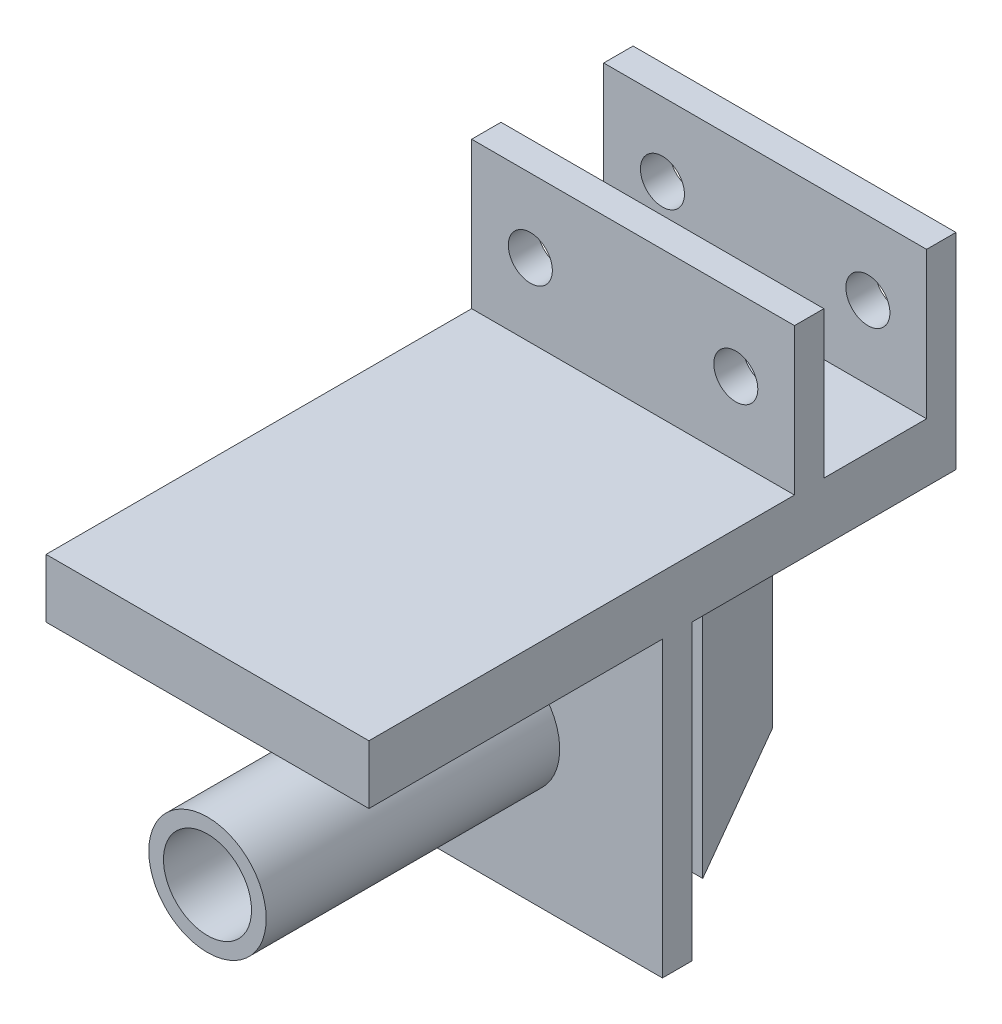
ISO-10303-21;
HEADER;
FILE_DESCRIPTION(('STEP AP214'),'2;1');
FILE_NAME('part.step','',(''),(''),'','','');
FILE_SCHEMA(('AUTOMOTIVE_DESIGN { 1 0 10303 214 1 1 1 1 }'));
ENDSEC;
DATA;
#1=APPLICATION_CONTEXT('core data for automotive mechanical design processes');
#2=APPLICATION_PROTOCOL_DEFINITION('international standard','automotive_design',2000,#1);
#3=PRODUCT_CONTEXT('',#1,'mechanical');
#4=PRODUCT('Part','Part','',(#3));
#5=PRODUCT_RELATED_PRODUCT_CATEGORY('part','',(#4));
#6=PRODUCT_DEFINITION_FORMATION('','',#4);
#7=PRODUCT_DEFINITION_CONTEXT('part definition',#1,'design');
#8=PRODUCT_DEFINITION('design','',#6,#7);
#9=PRODUCT_DEFINITION_SHAPE('','',#8);
#10=(LENGTH_UNIT() NAMED_UNIT(*) SI_UNIT(.MILLI.,.METRE.));
#11=(NAMED_UNIT(*) PLANE_ANGLE_UNIT() SI_UNIT($,.RADIAN.));
#12=(NAMED_UNIT(*) SI_UNIT($,.STERADIAN.) SOLID_ANGLE_UNIT());
#13=UNCERTAINTY_MEASURE_WITH_UNIT(LENGTH_MEASURE(1.E-05),#10,'distance_accuracy_value','');
#14=(GEOMETRIC_REPRESENTATION_CONTEXT(3) GLOBAL_UNCERTAINTY_ASSIGNED_CONTEXT((#13)) GLOBAL_UNIT_ASSIGNED_CONTEXT((#10,
#11,#12)) REPRESENTATION_CONTEXT('',''));
#15=CARTESIAN_POINT('',(0.,0.,0.));
#16=DIRECTION('',(0.,0.,1.));
#17=DIRECTION('',(1.,0.,0.));
#18=AXIS2_PLACEMENT_3D('',#15,#16,#17);
#19=CARTESIAN_POINT('',(0.,0.,0.));
#20=DIRECTION('',(0.,1.,0.));
#21=DIRECTION('',(0.,0.,1.));
#22=AXIS2_PLACEMENT_3D('',#19,#20,#21);
#23=PLANE('',#22);
#24=DIRECTION('',(1.,0.,0.));
#25=VECTOR('',#24,1.);
#26=CARTESIAN_POINT('',(-45.831985696917,0.,8.44161698032525));
#27=LINE('',#26,#25);
#28=CARTESIAN_POINT('',(-45.831985696917,0.,8.44161698032525));
#29=VERTEX_POINT('',#28);
#30=CARTESIAN_POINT('',(-23.831985696917,0.,8.44161698032525));
#31=VERTEX_POINT('',#30);
#32=EDGE_CURVE('E187',#29,#31,#27,.T.);
#33=ORIENTED_EDGE('',*,*,#32,.F.);
#34=DIRECTION('',(0.,0.,1.));
#35=VECTOR('',#34,1.);
#36=CARTESIAN_POINT('',(-45.831985696917,0.,-9.55838301967474));
#37=LINE('',#36,#35);
#38=CARTESIAN_POINT('',(-45.831985696917,0.,-9.55838301967474));
#39=VERTEX_POINT('',#38);
#40=EDGE_CURVE('E291',#39,#29,#37,.T.);
#41=ORIENTED_EDGE('',*,*,#40,.F.);
#42=DIRECTION('',(-1.,0.,0.));
#43=VECTOR('',#42,1.);
#44=CARTESIAN_POINT('',(-45.831985696917,0.,-9.55838301967474));
#45=LINE('',#44,#43);
#46=CARTESIAN_POINT('',(-23.831985696917,0.,-9.55838301967474));
#47=VERTEX_POINT('',#46);
#48=EDGE_CURVE('E300',#47,#39,#45,.T.);
#49=ORIENTED_EDGE('',*,*,#48,.F.);
#50=DIRECTION('',(0.,0.,-1.));
#51=VECTOR('',#50,1.);
#52=CARTESIAN_POINT('',(-23.831985696917,0.,-9.55838301967474));
#53=LINE('',#52,#51);
#54=EDGE_CURVE('E296',#31,#47,#53,.T.);
#55=ORIENTED_EDGE('',*,*,#54,.F.);
#56=EDGE_LOOP('',(#33,#41,#49,#55));
#57=FACE_BOUND('',#56,.T.);
#58=DIRECTION('',(0.5,0.,-0.866025403784439));
#59=VECTOR('',#58,1.);
#60=CARTESIAN_POINT('',(-41.331985696917,0.,3.19439373005782));
#61=LINE('',#60,#59);
#62=CARTESIAN_POINT('',(-41.331985696917,0.,3.19439373005782));
#63=VERTEX_POINT('',#62);
#64=CARTESIAN_POINT('',(-34.831985696917,0.,-8.06393651913988));
#65=VERTEX_POINT('',#64);
#66=EDGE_CURVE('E172',#63,#65,#61,.T.);
#67=ORIENTED_EDGE('',*,*,#66,.F.);
#68=DIRECTION('',(-1.,0.,0.));
#69=VECTOR('',#68,1.);
#70=CARTESIAN_POINT('',(-28.331985696917,0.,3.19439373005782));
#71=LINE('',#70,#69);
#72=CARTESIAN_POINT('',(-28.331985696917,0.,3.19439373005782));
#73=VERTEX_POINT('',#72);
#74=EDGE_CURVE('E55',#73,#63,#71,.T.);
#75=ORIENTED_EDGE('',*,*,#74,.F.);
#76=DIRECTION('',(0.5,0.,0.866025403784439));
#77=VECTOR('',#76,1.);
#78=CARTESIAN_POINT('',(-34.831985696917,0.,-8.06393651913988));
#79=LINE('',#78,#77);
#80=EDGE_CURVE('E51',#65,#73,#79,.T.);
#81=ORIENTED_EDGE('',*,*,#80,.F.);
#82=EDGE_LOOP('',(#67,#75,#81));
#83=FACE_BOUND('',#82,.T.);
#84=ADVANCED_FACE('F36',(#57,#83),#23,.F.);
#85=DIRECTION('',(-1.,0.,0.));
#86=VECTOR('',#85,1.);
#87=CARTESIAN_POINT('',(-45.831985696917,0.,10.4416169803253));
#88=LINE('',#87,#86);
#89=CARTESIAN_POINT('',(-23.831985696917,0.,10.4416169803253));
#90=VERTEX_POINT('',#89);
#91=CARTESIAN_POINT('',(-45.831985696917,0.,10.4416169803253));
#92=VERTEX_POINT('',#91);
#93=EDGE_CURVE('E192',#90,#92,#88,.T.);
#94=ORIENTED_EDGE('',*,*,#93,.F.);
#95=CARTESIAN_POINT('',(-23.831985696917,0.,30.4416169803253));
#96=VERTEX_POINT('',#95);
#97=EDGE_CURVE('E297',#96,#90,#53,.T.);
#98=ORIENTED_EDGE('',*,*,#97,.F.);
#99=DIRECTION('',(1.,0.,0.));
#100=VECTOR('',#99,1.);
#101=CARTESIAN_POINT('',(-45.831985696917,0.,30.4416169803253));
#102=LINE('',#101,#100);
#103=CARTESIAN_POINT('',(-45.831985696917,0.,30.4416169803253));
#104=VERTEX_POINT('',#103);
#105=EDGE_CURVE('E294',#104,#96,#102,.T.);
#106=ORIENTED_EDGE('',*,*,#105,.F.);
#107=EDGE_CURVE('E281',#92,#104,#37,.T.);
#108=ORIENTED_EDGE('',*,*,#107,.F.);
#109=EDGE_LOOP('',(#94,#98,#106,#108));
#110=FACE_BOUND('',#109,.T.);
#111=ADVANCED_FACE('F362',(#110),#23,.F.);
#112=CARTESIAN_POINT('',(0.,4.,0.));
#113=DIRECTION('',(0.,1.,0.));
#114=DIRECTION('',(0.,0.,1.));
#115=AXIS2_PLACEMENT_3D('',#112,#113,#114);
#116=PLANE('',#115);
#117=DIRECTION('',(0.,0.,-1.));
#118=VECTOR('',#117,1.);
#119=CARTESIAN_POINT('',(-23.831985696917,4.,-9.55838301967474));
#120=LINE('',#119,#118);
#121=CARTESIAN_POINT('',(-23.831985696917,4.,30.4416169803253));
#122=VERTEX_POINT('',#121);
#123=CARTESIAN_POINT('',(-23.831985696917,4.,1.44161698032526));
#124=VERTEX_POINT('',#123);
#125=EDGE_CURVE('E288',#122,#124,#120,.T.);
#126=ORIENTED_EDGE('',*,*,#125,.T.);
#127=DIRECTION('',(1.,0.,0.));
#128=VECTOR('',#127,1.);
#129=CARTESIAN_POINT('',(0.,4.,1.44161698032526));
#130=LINE('',#129,#128);
#131=CARTESIAN_POINT('',(-45.831985696917,4.,1.44161698032526));
#132=VERTEX_POINT('',#131);
#133=EDGE_CURVE('E234',#132,#124,#130,.T.);
#134=ORIENTED_EDGE('',*,*,#133,.F.);
#135=DIRECTION('',(0.,0.,1.));
#136=VECTOR('',#135,1.);
#137=CARTESIAN_POINT('',(-45.831985696917,4.,-9.55838301967474));
#138=LINE('',#137,#136);
#139=CARTESIAN_POINT('',(-45.831985696917,4.,30.4416169803253));
#140=VERTEX_POINT('',#139);
#141=EDGE_CURVE('E285',#132,#140,#138,.T.);
#142=ORIENTED_EDGE('',*,*,#141,.T.);
#143=DIRECTION('',(1.,0.,0.));
#144=VECTOR('',#143,1.);
#145=CARTESIAN_POINT('',(-45.831985696917,4.,30.4416169803253));
#146=LINE('',#145,#144);
#147=EDGE_CURVE('E284',#140,#122,#146,.T.);
#148=ORIENTED_EDGE('',*,*,#147,.T.);
#149=EDGE_LOOP('',(#126,#134,#142,#148));
#150=FACE_BOUND('',#149,.T.);
#151=ADVANCED_FACE('F352',(#150),#116,.T.);
#152=CARTESIAN_POINT('',(-45.831985696917,4.,-9.55838301967474));
#153=DIRECTION('',(1.,0.,0.));
#154=DIRECTION('',(0.,0.,-1.));
#155=AXIS2_PLACEMENT_3D('',#152,#153,#154);
#156=PLANE('',#155);
#157=ORIENTED_EDGE('',*,*,#40,.T.);
#158=DIRECTION('',(0.,1.,0.));
#159=VECTOR('',#158,1.);
#160=CARTESIAN_POINT('',(-45.831985696917,-20.,8.44161698032525));
#161=LINE('',#160,#159);
#162=CARTESIAN_POINT('',(-45.831985696917,-20.,8.44161698032525));
#163=VERTEX_POINT('',#162);
#164=EDGE_CURVE('E211',#163,#29,#161,.T.);
#165=ORIENTED_EDGE('',*,*,#164,.F.);
#166=DIRECTION('',(0.,0.,-1.));
#167=VECTOR('',#166,1.);
#168=CARTESIAN_POINT('',(-45.831985696917,-20.,10.4416169803253));
#169=LINE('',#168,#167);
#170=CARTESIAN_POINT('',(-45.831985696917,-20.,10.4416169803253));
#171=VERTEX_POINT('',#170);
#172=EDGE_CURVE('E188',#171,#163,#169,.T.);
#173=ORIENTED_EDGE('',*,*,#172,.F.);
#174=DIRECTION('',(0.,1.,0.));
#175=VECTOR('',#174,1.);
#176=CARTESIAN_POINT('',(-45.831985696917,-20.,10.4416169803253));
#177=LINE('',#176,#175);
#178=EDGE_CURVE('E198',#171,#92,#177,.T.);
#179=ORIENTED_EDGE('',*,*,#178,.T.);
#180=ORIENTED_EDGE('',*,*,#107,.T.);
#181=DIRECTION('',(0.,-1.,0.));
#182=VECTOR('',#181,1.);
#183=CARTESIAN_POINT('',(-45.831985696917,4.,30.4416169803253));
#184=LINE('',#183,#182);
#185=EDGE_CURVE('E44',#140,#104,#184,.T.);
#186=ORIENTED_EDGE('',*,*,#185,.F.);
#187=ORIENTED_EDGE('',*,*,#141,.F.);
#188=DIRECTION('',(0.,-1.,0.));
#189=VECTOR('',#188,1.);
#190=CARTESIAN_POINT('',(-45.831985696917,14.,1.44161698032526));
#191=LINE('',#190,#189);
#192=CARTESIAN_POINT('',(-45.831985696917,14.,1.44161698032526));
#193=VERTEX_POINT('',#192);
#194=EDGE_CURVE('E258',#193,#132,#191,.T.);
#195=ORIENTED_EDGE('',*,*,#194,.F.);
#196=DIRECTION('',(0.,0.,1.));
#197=VECTOR('',#196,1.);
#198=CARTESIAN_POINT('',(-45.831985696917,14.,0.));
#199=LINE('',#198,#197);
#200=CARTESIAN_POINT('',(-45.831985696917,14.,-0.558383019674744));
#201=VERTEX_POINT('',#200);
#202=EDGE_CURVE('E235',#201,#193,#199,.T.);
#203=ORIENTED_EDGE('',*,*,#202,.F.);
#204=DIRECTION('',(0.,-1.,0.));
#205=VECTOR('',#204,1.);
#206=CARTESIAN_POINT('',(-45.831985696917,14.,-0.558383019674744));
#207=LINE('',#206,#205);
#208=CARTESIAN_POINT('',(-45.831985696917,4.,-0.558383019674744));
#209=VERTEX_POINT('',#208);
#210=EDGE_CURVE('E246',#201,#209,#207,.T.);
#211=ORIENTED_EDGE('',*,*,#210,.T.);
#212=CARTESIAN_POINT('',(-45.831985696917,4.,-7.55838301967474));
#213=VERTEX_POINT('',#212);
#214=EDGE_CURVE('E282',#213,#209,#138,.T.);
#215=ORIENTED_EDGE('',*,*,#214,.F.);
#216=DIRECTION('',(0.,-1.,0.));
#217=VECTOR('',#216,1.);
#218=CARTESIAN_POINT('',(-45.831985696917,14.,-7.55838301967474));
#219=LINE('',#218,#217);
#220=CARTESIAN_POINT('',(-45.831985696917,14.,-7.55838301967474));
#221=VERTEX_POINT('',#220);
#222=EDGE_CURVE('E278',#221,#213,#219,.T.);
#223=ORIENTED_EDGE('',*,*,#222,.F.);
#224=DIRECTION('',(0.,0.,1.));
#225=VECTOR('',#224,1.);
#226=CARTESIAN_POINT('',(-45.831985696917,14.,0.));
#227=LINE('',#226,#225);
#228=CARTESIAN_POINT('',(-45.831985696917,14.,-9.55838301967474));
#229=VERTEX_POINT('',#228);
#230=EDGE_CURVE('E262',#229,#221,#227,.T.);
#231=ORIENTED_EDGE('',*,*,#230,.F.);
#232=DIRECTION('',(0.,-1.,0.));
#233=VECTOR('',#232,1.);
#234=CARTESIAN_POINT('',(-45.831985696917,4.,-9.55838301967474));
#235=LINE('',#234,#233);
#236=EDGE_CURVE('E290',#229,#39,#235,.T.);
#237=ORIENTED_EDGE('',*,*,#236,.T.);
#238=EDGE_LOOP('',(#157,#165,#173,#179,#180,#186,#187,#195,#203,#211,#215,#223,#231,#237));
#239=FACE_BOUND('',#238,.T.);
#240=ADVANCED_FACE('F38',(#239),#156,.F.);
#241=CARTESIAN_POINT('',(-45.831985696917,4.,30.4416169803253));
#242=DIRECTION('',(0.,0.,-1.));
#243=DIRECTION('',(-1.,0.,0.));
#244=AXIS2_PLACEMENT_3D('',#241,#242,#243);
#245=PLANE('',#244);
#246=ORIENTED_EDGE('',*,*,#105,.T.);
#247=DIRECTION('',(0.,-1.,0.));
#248=VECTOR('',#247,1.);
#249=CARTESIAN_POINT('',(-23.831985696917,4.,30.4416169803253));
#250=LINE('',#249,#248);
#251=EDGE_CURVE('E307',#122,#96,#250,.T.);
#252=ORIENTED_EDGE('',*,*,#251,.F.);
#253=ORIENTED_EDGE('',*,*,#147,.F.);
#254=ORIENTED_EDGE('',*,*,#185,.T.);
#255=EDGE_LOOP('',(#246,#252,#253,#254));
#256=FACE_BOUND('',#255,.T.);
#257=ADVANCED_FACE('F357',(#256),#245,.F.);
#258=CARTESIAN_POINT('',(-23.831985696917,4.,-9.55838301967474));
#259=DIRECTION('',(-1.,0.,0.));
#260=DIRECTION('',(0.,0.,1.));
#261=AXIS2_PLACEMENT_3D('',#258,#259,#260);
#262=PLANE('',#261);
#263=ORIENTED_EDGE('',*,*,#97,.T.);
#264=DIRECTION('',(0.,1.,0.));
#265=VECTOR('',#264,1.);
#266=CARTESIAN_POINT('',(-23.831985696917,-20.,10.4416169803253));
#267=LINE('',#266,#265);
#268=CARTESIAN_POINT('',(-23.831985696917,-20.,10.4416169803253));
#269=VERTEX_POINT('',#268);
#270=EDGE_CURVE('E205',#269,#90,#267,.T.);
#271=ORIENTED_EDGE('',*,*,#270,.F.);
#272=DIRECTION('',(0.,0.,1.));
#273=VECTOR('',#272,1.);
#274=CARTESIAN_POINT('',(-23.831985696917,-20.,10.4416169803253));
#275=LINE('',#274,#273);
#276=CARTESIAN_POINT('',(-23.831985696917,-20.,8.44161698032525));
#277=VERTEX_POINT('',#276);
#278=EDGE_CURVE('E194',#277,#269,#275,.T.);
#279=ORIENTED_EDGE('',*,*,#278,.F.);
#280=DIRECTION('',(0.,1.,0.));
#281=VECTOR('',#280,1.);
#282=CARTESIAN_POINT('',(-23.831985696917,-20.,8.44161698032525));
#283=LINE('',#282,#281);
#284=EDGE_CURVE('E208',#277,#31,#283,.T.);
#285=ORIENTED_EDGE('',*,*,#284,.T.);
#286=ORIENTED_EDGE('',*,*,#54,.T.);
#287=DIRECTION('',(0.,-1.,0.));
#288=VECTOR('',#287,1.);
#289=CARTESIAN_POINT('',(-23.831985696917,4.,-9.55838301967474));
#290=LINE('',#289,#288);
#291=CARTESIAN_POINT('',(-23.831985696917,14.,-9.55838301967474));
#292=VERTEX_POINT('',#291);
#293=EDGE_CURVE('E304',#292,#47,#290,.T.);
#294=ORIENTED_EDGE('',*,*,#293,.F.);
#295=DIRECTION('',(0.,0.,-1.));
#296=VECTOR('',#295,1.);
#297=CARTESIAN_POINT('',(-23.831985696917,14.,0.));
#298=LINE('',#297,#296);
#299=CARTESIAN_POINT('',(-23.831985696917,14.,-7.55838301967474));
#300=VERTEX_POINT('',#299);
#301=EDGE_CURVE('E267',#300,#292,#298,.T.);
#302=ORIENTED_EDGE('',*,*,#301,.F.);
#303=DIRECTION('',(0.,-1.,0.));
#304=VECTOR('',#303,1.);
#305=CARTESIAN_POINT('',(-23.831985696917,14.,-7.55838301967474));
#306=LINE('',#305,#304);
#307=CARTESIAN_POINT('',(-23.831985696917,4.,-7.55838301967474));
#308=VERTEX_POINT('',#307);
#309=EDGE_CURVE('E273',#300,#308,#306,.T.);
#310=ORIENTED_EDGE('',*,*,#309,.T.);
#311=CARTESIAN_POINT('',(-23.831985696917,4.,-0.558383019674744));
#312=VERTEX_POINT('',#311);
#313=EDGE_CURVE('E287',#312,#308,#120,.T.);
#314=ORIENTED_EDGE('',*,*,#313,.F.);
#315=DIRECTION('',(0.,-1.,0.));
#316=VECTOR('',#315,1.);
#317=CARTESIAN_POINT('',(-23.831985696917,14.,-0.558383019674744));
#318=LINE('',#317,#316);
#319=CARTESIAN_POINT('',(-23.831985696917,14.,-0.558383019674744));
#320=VERTEX_POINT('',#319);
#321=EDGE_CURVE('E252',#320,#312,#318,.T.);
#322=ORIENTED_EDGE('',*,*,#321,.F.);
#323=DIRECTION('',(0.,0.,-1.));
#324=VECTOR('',#323,1.);
#325=CARTESIAN_POINT('',(-23.831985696917,14.,0.));
#326=LINE('',#325,#324);
#327=CARTESIAN_POINT('',(-23.831985696917,14.,1.44161698032526));
#328=VERTEX_POINT('',#327);
#329=EDGE_CURVE('E241',#328,#320,#326,.T.);
#330=ORIENTED_EDGE('',*,*,#329,.F.);
#331=DIRECTION('',(0.,-1.,0.));
#332=VECTOR('',#331,1.);
#333=CARTESIAN_POINT('',(-23.831985696917,14.,1.44161698032526));
#334=LINE('',#333,#332);
#335=EDGE_CURVE('E255',#328,#124,#334,.T.);
#336=ORIENTED_EDGE('',*,*,#335,.T.);
#337=ORIENTED_EDGE('',*,*,#125,.F.);
#338=ORIENTED_EDGE('',*,*,#251,.T.);
#339=EDGE_LOOP('',(#263,#271,#279,#285,#286,#294,#302,#310,#314,#322,#330,#336,#337,#338));
#340=FACE_BOUND('',#339,.T.);
#341=ADVANCED_FACE('F335',(#340),#262,.F.);
#342=CARTESIAN_POINT('',(-45.831985696917,4.,-9.55838301967474));
#343=DIRECTION('',(0.,0.,1.));
#344=DIRECTION('',(1.,0.,0.));
#345=AXIS2_PLACEMENT_3D('',#342,#343,#344);
#346=PLANE('',#345);
#347=CARTESIAN_POINT('',(-27.831985696917,9.,-9.55838301967474));
#348=DIRECTION('',(0.,0.,1.));
#349=DIRECTION('',(1.,0.,0.));
#350=AXIS2_PLACEMENT_3D('',#347,#348,#349);
#351=CIRCLE('',#350,1.5);
#352=CARTESIAN_POINT('',(-26.331985696917,9.,-9.55838301967474));
#353=VERTEX_POINT('',#352);
#354=EDGE_CURVE('E215',#353,#353,#351,.T.);
#355=ORIENTED_EDGE('',*,*,#354,.T.);
#356=EDGE_LOOP('',(#355));
#357=FACE_BOUND('',#356,.T.);
#358=CARTESIAN_POINT('',(-41.831985696917,9.,-9.55838301967474));
#359=DIRECTION('',(0.,0.,1.));
#360=DIRECTION('',(1.,0.,0.));
#361=AXIS2_PLACEMENT_3D('',#358,#359,#360);
#362=CIRCLE('',#361,1.5);
#363=CARTESIAN_POINT('',(-40.331985696917,9.,-9.55838301967474));
#364=VERTEX_POINT('',#363);
#365=EDGE_CURVE('E225',#364,#364,#362,.T.);
#366=ORIENTED_EDGE('',*,*,#365,.T.);
#367=EDGE_LOOP('',(#366));
#368=FACE_BOUND('',#367,.T.);
#369=ORIENTED_EDGE('',*,*,#48,.T.);
#370=ORIENTED_EDGE('',*,*,#236,.F.);
#371=DIRECTION('',(-1.,0.,0.));
#372=VECTOR('',#371,1.);
#373=CARTESIAN_POINT('',(0.,14.,-9.55838301967474));
#374=LINE('',#373,#372);
#375=EDGE_CURVE('E270',#292,#229,#374,.T.);
#376=ORIENTED_EDGE('',*,*,#375,.F.);
#377=ORIENTED_EDGE('',*,*,#293,.T.);
#378=EDGE_LOOP('',(#369,#370,#376,#377));
#379=FACE_BOUND('',#378,.T.);
#380=ADVANCED_FACE('F380',(#357,#368,#379),#346,.F.);
#381=DIRECTION('',(1.,0.,0.));
#382=VECTOR('',#381,1.);
#383=CARTESIAN_POINT('',(0.,4.,-0.558383019674744));
#384=LINE('',#383,#382);
#385=EDGE_CURVE('E239',#209,#312,#384,.T.);
#386=ORIENTED_EDGE('',*,*,#385,.T.);
#387=ORIENTED_EDGE('',*,*,#313,.T.);
#388=DIRECTION('',(1.,0.,0.));
#389=VECTOR('',#388,1.);
#390=CARTESIAN_POINT('',(0.,4.,-7.55838301967474));
#391=LINE('',#390,#389);
#392=EDGE_CURVE('E261',#213,#308,#391,.T.);
#393=ORIENTED_EDGE('',*,*,#392,.F.);
#394=ORIENTED_EDGE('',*,*,#214,.T.);
#395=EDGE_LOOP('',(#386,#387,#393,#394));
#396=FACE_BOUND('',#395,.T.);
#397=ADVANCED_FACE('F332',(#396),#116,.T.);
#398=CARTESIAN_POINT('',(0.,14.,-7.55838301967474));
#399=DIRECTION('',(0.,0.,-1.));
#400=DIRECTION('',(-1.,0.,0.));
#401=AXIS2_PLACEMENT_3D('',#398,#399,#400);
#402=PLANE('',#401);
#403=CARTESIAN_POINT('',(-27.831985696917,9.,-7.55838301967474));
#404=DIRECTION('',(0.,0.,-1.));
#405=DIRECTION('',(-1.,0.,0.));
#406=AXIS2_PLACEMENT_3D('',#403,#404,#405);
#407=CIRCLE('',#406,1.5);
#408=CARTESIAN_POINT('',(-29.331985696917,9.,-7.55838301967474));
#409=VERTEX_POINT('',#408);
#410=EDGE_CURVE('E221',#409,#409,#407,.T.);
#411=ORIENTED_EDGE('',*,*,#410,.T.);
#412=EDGE_LOOP('',(#411));
#413=FACE_BOUND('',#412,.T.);
#414=CARTESIAN_POINT('',(-41.831985696917,9.,-7.55838301967474));
#415=DIRECTION('',(0.,0.,-1.));
#416=DIRECTION('',(-1.,0.,0.));
#417=AXIS2_PLACEMENT_3D('',#414,#415,#416);
#418=CIRCLE('',#417,1.5);
#419=CARTESIAN_POINT('',(-43.331985696917,9.,-7.55838301967474));
#420=VERTEX_POINT('',#419);
#421=EDGE_CURVE('E231',#420,#420,#418,.T.);
#422=ORIENTED_EDGE('',*,*,#421,.T.);
#423=EDGE_LOOP('',(#422));
#424=FACE_BOUND('',#423,.T.);
#425=ORIENTED_EDGE('',*,*,#392,.T.);
#426=ORIENTED_EDGE('',*,*,#309,.F.);
#427=DIRECTION('',(1.,0.,0.));
#428=VECTOR('',#427,1.);
#429=CARTESIAN_POINT('',(0.,14.,-7.55838301967474));
#430=LINE('',#429,#428);
#431=EDGE_CURVE('E265',#221,#300,#430,.T.);
#432=ORIENTED_EDGE('',*,*,#431,.F.);
#433=ORIENTED_EDGE('',*,*,#222,.T.);
#434=EDGE_LOOP('',(#425,#426,#432,#433));
#435=FACE_BOUND('',#434,.T.);
#436=ADVANCED_FACE('F340',(#413,#424,#435),#402,.F.);
#437=CARTESIAN_POINT('',(0.,14.,0.));
#438=DIRECTION('',(0.,1.,0.));
#439=DIRECTION('',(0.,0.,1.));
#440=AXIS2_PLACEMENT_3D('',#437,#438,#439);
#441=PLANE('',#440);
#442=ORIENTED_EDGE('',*,*,#230,.T.);
#443=ORIENTED_EDGE('',*,*,#431,.T.);
#444=ORIENTED_EDGE('',*,*,#301,.T.);
#445=ORIENTED_EDGE('',*,*,#375,.T.);
#446=EDGE_LOOP('',(#442,#443,#444,#445));
#447=FACE_BOUND('',#446,.T.);
#448=ADVANCED_FACE('F382',(#447),#441,.T.);
#449=CARTESIAN_POINT('',(0.,14.,1.44161698032526));
#450=DIRECTION('',(0.,0.,-1.));
#451=DIRECTION('',(-1.,0.,0.));
#452=AXIS2_PLACEMENT_3D('',#449,#450,#451);
#453=PLANE('',#452);
#454=CARTESIAN_POINT('',(-27.831985696917,9.,1.44161698032526));
#455=DIRECTION('',(0.,0.,1.));
#456=DIRECTION('',(1.,0.,0.));
#457=AXIS2_PLACEMENT_3D('',#454,#455,#456);
#458=CIRCLE('',#457,1.5);
#459=CARTESIAN_POINT('',(-26.331985696917,9.,1.44161698032526));
#460=VERTEX_POINT('',#459);
#461=EDGE_CURVE('E214',#460,#460,#458,.T.);
#462=ORIENTED_EDGE('',*,*,#461,.F.);
#463=EDGE_LOOP('',(#462));
#464=FACE_BOUND('',#463,.T.);
#465=CARTESIAN_POINT('',(-41.831985696917,9.,1.44161698032526));
#466=DIRECTION('',(0.,0.,1.));
#467=DIRECTION('',(1.,0.,0.));
#468=AXIS2_PLACEMENT_3D('',#465,#466,#467);
#469=CIRCLE('',#468,1.5);
#470=CARTESIAN_POINT('',(-40.331985696917,9.,1.44161698032526));
#471=VERTEX_POINT('',#470);
#472=EDGE_CURVE('E224',#471,#471,#469,.T.);
#473=ORIENTED_EDGE('',*,*,#472,.F.);
#474=EDGE_LOOP('',(#473));
#475=FACE_BOUND('',#474,.T.);
#476=ORIENTED_EDGE('',*,*,#133,.T.);
#477=ORIENTED_EDGE('',*,*,#335,.F.);
#478=DIRECTION('',(1.,0.,0.));
#479=VECTOR('',#478,1.);
#480=CARTESIAN_POINT('',(0.,14.,1.44161698032526));
#481=LINE('',#480,#479);
#482=EDGE_CURVE('E238',#193,#328,#481,.T.);
#483=ORIENTED_EDGE('',*,*,#482,.F.);
#484=ORIENTED_EDGE('',*,*,#194,.T.);
#485=EDGE_LOOP('',(#476,#477,#483,#484));
#486=FACE_BOUND('',#485,.T.);
#487=ADVANCED_FACE('F323',(#464,#475,#486),#453,.F.);
#488=CARTESIAN_POINT('',(0.,14.,-0.558383019674744));
#489=DIRECTION('',(0.,0.,-1.));
#490=DIRECTION('',(-1.,0.,0.));
#491=AXIS2_PLACEMENT_3D('',#488,#489,#490);
#492=PLANE('',#491);
#493=CARTESIAN_POINT('',(-27.831985696917,9.,-0.558383019674744));
#494=DIRECTION('',(0.,0.,-1.));
#495=DIRECTION('',(-1.,0.,0.));
#496=AXIS2_PLACEMENT_3D('',#493,#494,#495);
#497=CIRCLE('',#496,1.5);
#498=CARTESIAN_POINT('',(-29.331985696917,9.,-0.558383019674744));
#499=VERTEX_POINT('',#498);
#500=EDGE_CURVE('E218',#499,#499,#497,.T.);
#501=ORIENTED_EDGE('',*,*,#500,.F.);
#502=EDGE_LOOP('',(#501));
#503=FACE_BOUND('',#502,.T.);
#504=CARTESIAN_POINT('',(-41.831985696917,9.,-0.558383019674744));
#505=DIRECTION('',(0.,0.,-1.));
#506=DIRECTION('',(-1.,0.,0.));
#507=AXIS2_PLACEMENT_3D('',#504,#505,#506);
#508=CIRCLE('',#507,1.5);
#509=CARTESIAN_POINT('',(-43.331985696917,9.,-0.558383019674744));
#510=VERTEX_POINT('',#509);
#511=EDGE_CURVE('E228',#510,#510,#508,.T.);
#512=ORIENTED_EDGE('',*,*,#511,.F.);
#513=EDGE_LOOP('',(#512));
#514=FACE_BOUND('',#513,.T.);
#515=ORIENTED_EDGE('',*,*,#385,.F.);
#516=ORIENTED_EDGE('',*,*,#210,.F.);
#517=DIRECTION('',(1.,0.,0.));
#518=VECTOR('',#517,1.);
#519=CARTESIAN_POINT('',(0.,14.,-0.558383019674744));
#520=LINE('',#519,#518);
#521=EDGE_CURVE('E243',#201,#320,#520,.T.);
#522=ORIENTED_EDGE('',*,*,#521,.T.);
#523=ORIENTED_EDGE('',*,*,#321,.T.);
#524=EDGE_LOOP('',(#515,#516,#522,#523));
#525=FACE_BOUND('',#524,.T.);
#526=ADVANCED_FACE('F319',(#503,#514,#525),#492,.T.);
#527=CARTESIAN_POINT('',(0.,14.,0.));
#528=DIRECTION('',(0.,1.,0.));
#529=DIRECTION('',(0.,0.,1.));
#530=AXIS2_PLACEMENT_3D('',#527,#528,#529);
#531=PLANE('',#530);
#532=ORIENTED_EDGE('',*,*,#202,.T.);
#533=ORIENTED_EDGE('',*,*,#482,.T.);
#534=ORIENTED_EDGE('',*,*,#329,.T.);
#535=ORIENTED_EDGE('',*,*,#521,.F.);
#536=EDGE_LOOP('',(#532,#533,#534,#535));
#537=FACE_BOUND('',#536,.T.);
#538=ADVANCED_FACE('F322',(#537),#531,.T.);
#539=CARTESIAN_POINT('',(-41.831985696917,9.,-9.55838301967474));
#540=DIRECTION('',(0.,0.,1.));
#541=DIRECTION('',(1.,0.,0.));
#542=AXIS2_PLACEMENT_3D('',#539,#540,#541);
#543=CYLINDRICAL_SURFACE('',#542,1.5);
#544=ORIENTED_EDGE('',*,*,#511,.T.);
#545=EDGE_LOOP('',(#544));
#546=FACE_BOUND('',#545,.T.);
#547=ORIENTED_EDGE('',*,*,#472,.T.);
#548=EDGE_LOOP('',(#547));
#549=FACE_BOUND('',#548,.T.);
#550=ADVANCED_FACE('F445',(#546,#549),#543,.F.);
#551=ORIENTED_EDGE('',*,*,#365,.F.);
#552=EDGE_LOOP('',(#551));
#553=FACE_BOUND('',#552,.T.);
#554=ORIENTED_EDGE('',*,*,#421,.F.);
#555=EDGE_LOOP('',(#554));
#556=FACE_BOUND('',#555,.T.);
#557=ADVANCED_FACE('F450',(#553,#556),#543,.F.);
#558=CARTESIAN_POINT('',(-27.831985696917,9.,-9.55838301967474));
#559=DIRECTION('',(0.,0.,1.));
#560=DIRECTION('',(1.,0.,0.));
#561=AXIS2_PLACEMENT_3D('',#558,#559,#560);
#562=CYLINDRICAL_SURFACE('',#561,1.5);
#563=ORIENTED_EDGE('',*,*,#500,.T.);
#564=EDGE_LOOP('',(#563));
#565=FACE_BOUND('',#564,.T.);
#566=ORIENTED_EDGE('',*,*,#461,.T.);
#567=EDGE_LOOP('',(#566));
#568=FACE_BOUND('',#567,.T.);
#569=ADVANCED_FACE('F316',(#565,#568),#562,.F.);
#570=ORIENTED_EDGE('',*,*,#354,.F.);
#571=EDGE_LOOP('',(#570));
#572=FACE_BOUND('',#571,.T.);
#573=ORIENTED_EDGE('',*,*,#410,.F.);
#574=EDGE_LOOP('',(#573));
#575=FACE_BOUND('',#574,.T.);
#576=ADVANCED_FACE('F468',(#572,#575),#562,.F.);
#577=CARTESIAN_POINT('',(-45.831985696917,-20.,8.44161698032525));
#578=DIRECTION('',(0.,0.,1.));
#579=DIRECTION('',(1.,0.,0.));
#580=AXIS2_PLACEMENT_3D('',#577,#578,#579);
#581=PLANE('',#580);
#582=ORIENTED_EDGE('',*,*,#32,.T.);
#583=ORIENTED_EDGE('',*,*,#284,.F.);
#584=DIRECTION('',(1.,0.,0.));
#585=VECTOR('',#584,1.);
#586=CARTESIAN_POINT('',(-45.831985696917,-20.,8.44161698032525));
#587=LINE('',#586,#585);
#588=EDGE_CURVE('E191',#163,#277,#587,.T.);
#589=ORIENTED_EDGE('',*,*,#588,.F.);
#590=ORIENTED_EDGE('',*,*,#164,.T.);
#591=EDGE_LOOP('',(#582,#583,#589,#590));
#592=FACE_BOUND('',#591,.T.);
#593=ADVANCED_FACE('F374',(#592),#581,.F.);
#594=CARTESIAN_POINT('',(-45.831985696917,-20.,10.4416169803253));
#595=DIRECTION('',(0.,0.,-1.));
#596=DIRECTION('',(-1.,0.,0.));
#597=AXIS2_PLACEMENT_3D('',#594,#595,#596);
#598=PLANE('',#597);
#599=CARTESIAN_POINT('',(-34.831985696917,-10.,10.4416169803253));
#600=DIRECTION('',(0.,0.,-1.));
#601=DIRECTION('',(-1.,0.,0.));
#602=AXIS2_PLACEMENT_3D('',#599,#600,#601);
#603=CIRCLE('',#602,4.);
#604=CARTESIAN_POINT('',(-38.831985696917,-10.,10.4416169803253));
#605=VERTEX_POINT('',#604);
#606=EDGE_CURVE('E11',#605,#605,#603,.F.);
#607=ORIENTED_EDGE('',*,*,#606,.F.);
#608=EDGE_LOOP('',(#607));
#609=FACE_BOUND('',#608,.T.);
#610=ORIENTED_EDGE('',*,*,#93,.T.);
#611=ORIENTED_EDGE('',*,*,#178,.F.);
#612=DIRECTION('',(-1.,0.,0.));
#613=VECTOR('',#612,1.);
#614=CARTESIAN_POINT('',(-45.831985696917,-20.,10.4416169803253));
#615=LINE('',#614,#613);
#616=EDGE_CURVE('E196',#269,#171,#615,.T.);
#617=ORIENTED_EDGE('',*,*,#616,.F.);
#618=ORIENTED_EDGE('',*,*,#270,.T.);
#619=EDGE_LOOP('',(#610,#611,#617,#618));
#620=FACE_BOUND('',#619,.T.);
#621=ADVANCED_FACE('F365',(#609,#620),#598,.F.);
#622=CARTESIAN_POINT('',(0.,-20.,0.));
#623=DIRECTION('',(0.,-1.,0.));
#624=DIRECTION('',(0.,0.,-1.));
#625=AXIS2_PLACEMENT_3D('',#622,#623,#624);
#626=PLANE('',#625);
#627=ORIENTED_EDGE('',*,*,#172,.T.);
#628=ORIENTED_EDGE('',*,*,#588,.T.);
#629=ORIENTED_EDGE('',*,*,#278,.T.);
#630=ORIENTED_EDGE('',*,*,#616,.T.);
#631=EDGE_LOOP('',(#627,#628,#629,#630));
#632=FACE_BOUND('',#631,.T.);
#633=ADVANCED_FACE('F370',(#632),#626,.T.);
#634=CARTESIAN_POINT('',(-34.831985696917,-10.,30.4416169803253));
#635=DIRECTION('',(0.,0.,1.));
#636=DIRECTION('',(1.,0.,0.));
#637=AXIS2_PLACEMENT_3D('',#634,#635,#636);
#638=PLANE('',#637);
#639=CARTESIAN_POINT('',(-34.831985696917,-10.,30.4416169803253));
#640=DIRECTION('',(0.,0.,1.));
#641=DIRECTION('',(1.,0.,0.));
#642=AXIS2_PLACEMENT_3D('',#639,#640,#641);
#643=CIRCLE('',#642,4.);
#644=CARTESIAN_POINT('',(-30.831985696917,-10.,30.4416169803253));
#645=VERTEX_POINT('',#644);
#646=EDGE_CURVE('E183',#645,#645,#643,.T.);
#647=ORIENTED_EDGE('',*,*,#646,.T.);
#648=EDGE_LOOP('',(#647));
#649=FACE_BOUND('',#648,.T.);
#650=CARTESIAN_POINT('',(-34.831985696917,-10.,30.4416169803253));
#651=DIRECTION('',(0.,0.,1.));
#652=DIRECTION('',(1.,0.,0.));
#653=AXIS2_PLACEMENT_3D('',#650,#651,#652);
#654=CIRCLE('',#653,3.);
#655=CARTESIAN_POINT('',(-31.831985696917,-10.,30.4416169803253));
#656=VERTEX_POINT('',#655);
#657=EDGE_CURVE('E176',#656,#656,#654,.T.);
#658=ORIENTED_EDGE('',*,*,#657,.F.);
#659=EDGE_LOOP('',(#658));
#660=FACE_BOUND('',#659,.T.);
#661=ADVANCED_FACE('F513',(#649,#660),#638,.T.);
#662=CARTESIAN_POINT('',(-34.831985696917,-10.,30.4416169803253));
#663=DIRECTION('',(0.,0.,-1.));
#664=DIRECTION('',(-1.,0.,0.));
#665=AXIS2_PLACEMENT_3D('',#662,#663,#664);
#666=CYLINDRICAL_SURFACE('',#665,4.);
#667=ORIENTED_EDGE('',*,*,#646,.F.);
#668=EDGE_LOOP('',(#667));
#669=FACE_BOUND('',#668,.T.);
#670=ORIENTED_EDGE('',*,*,#606,.T.);
#671=EDGE_LOOP('',(#670));
#672=FACE_BOUND('',#671,.T.);
#673=ADVANCED_FACE('F531',(#669,#672),#666,.T.);
#674=CARTESIAN_POINT('',(-34.831985696917,-10.,30.4416169803253));
#675=DIRECTION('',(0.,0.,-1.));
#676=DIRECTION('',(-1.,0.,0.));
#677=AXIS2_PLACEMENT_3D('',#674,#675,#676);
#678=CYLINDRICAL_SURFACE('',#677,3.);
#679=ORIENTED_EDGE('',*,*,#657,.T.);
#680=EDGE_LOOP('',(#679));
#681=FACE_BOUND('',#680,.T.);
#682=CARTESIAN_POINT('',(-34.831985696917,-10.,10.4416169803253));
#683=DIRECTION('',(0.,0.,1.));
#684=DIRECTION('',(1.,0.,0.));
#685=AXIS2_PLACEMENT_3D('',#682,#683,#684);
#686=CIRCLE('',#685,3.);
#687=CARTESIAN_POINT('',(-31.831985696917,-10.,10.4416169803253));
#688=VERTEX_POINT('',#687);
#689=EDGE_CURVE('E173',#688,#688,#686,.T.);
#690=ORIENTED_EDGE('',*,*,#689,.F.);
#691=EDGE_LOOP('',(#690));
#692=FACE_BOUND('',#691,.T.);
#693=ADVANCED_FACE('F541',(#681,#692),#678,.F.);
#694=ORIENTED_EDGE('',*,*,#689,.T.);
#695=EDGE_LOOP('',(#694));
#696=FACE_BOUND('',#695,.T.);
#697=ADVANCED_FACE('F524',(#696),#598,.F.);
#698=CARTESIAN_POINT('',(-41.331985696917,-20.,3.19439373005782));
#699=DIRECTION('',(0.866025403784439,0.,0.5));
#700=DIRECTION('',(0.5,0.,-0.866025403784439));
#701=AXIS2_PLACEMENT_3D('',#698,#699,#700);
#702=PLANE('',#701);
#703=ORIENTED_EDGE('',*,*,#66,.T.);
#704=DIRECTION('',(0.,1.,0.));
#705=VECTOR('',#704,1.);
#706=CARTESIAN_POINT('',(-34.831985696917,-20.,-8.06393651913988));
#707=LINE('',#706,#705);
#708=CARTESIAN_POINT('',(-34.831985696917,-20.,-8.06393651913988));
#709=VERTEX_POINT('',#708);
#710=EDGE_CURVE('E156',#709,#65,#707,.T.);
#711=ORIENTED_EDGE('',*,*,#710,.F.);
#712=DIRECTION('',(0.5,0.,-0.866025403784439));
#713=VECTOR('',#712,1.);
#714=CARTESIAN_POINT('',(-41.331985696917,-20.,3.19439373005782));
#715=LINE('',#714,#713);
#716=CARTESIAN_POINT('',(-41.331985696917,-20.,3.19439373005782));
#717=VERTEX_POINT('',#716);
#718=EDGE_CURVE('E163',#717,#709,#715,.T.);
#719=ORIENTED_EDGE('',*,*,#718,.F.);
#720=DIRECTION('',(0.,1.,0.));
#721=VECTOR('',#720,1.);
#722=CARTESIAN_POINT('',(-41.331985696917,-20.,3.19439373005782));
#723=LINE('',#722,#721);
#724=EDGE_CURVE('E178',#717,#63,#723,.T.);
#725=ORIENTED_EDGE('',*,*,#724,.T.);
#726=EDGE_LOOP('',(#703,#711,#719,#725));
#727=FACE_BOUND('',#726,.T.);
#728=ADVANCED_FACE('F171',(#727),#702,.F.);
#729=CARTESIAN_POINT('',(-34.831985696917,-20.,-8.06393651913988));
#730=DIRECTION('',(-0.866025403784439,0.,0.5));
#731=DIRECTION('',(0.5,0.,0.866025403784439));
#732=AXIS2_PLACEMENT_3D('',#729,#730,#731);
#733=PLANE('',#732);
#734=ORIENTED_EDGE('',*,*,#80,.T.);
#735=DIRECTION('',(0.,1.,0.));
#736=VECTOR('',#735,1.);
#737=CARTESIAN_POINT('',(-28.331985696917,-20.,3.19439373005782));
#738=LINE('',#737,#736);
#739=CARTESIAN_POINT('',(-28.331985696917,-20.,3.19439373005782));
#740=VERTEX_POINT('',#739);
#741=EDGE_CURVE('E159',#740,#73,#738,.T.);
#742=ORIENTED_EDGE('',*,*,#741,.F.);
#743=DIRECTION('',(0.5,0.,0.866025403784439));
#744=VECTOR('',#743,1.);
#745=CARTESIAN_POINT('',(-34.831985696917,-20.,-8.06393651913988));
#746=LINE('',#745,#744);
#747=EDGE_CURVE('E152',#709,#740,#746,.T.);
#748=ORIENTED_EDGE('',*,*,#747,.F.);
#749=ORIENTED_EDGE('',*,*,#710,.T.);
#750=EDGE_LOOP('',(#734,#742,#748,#749));
#751=FACE_BOUND('',#750,.T.);
#752=ADVANCED_FACE('F154',(#751),#733,.F.);
#753=CARTESIAN_POINT('',(-28.331985696917,-20.,3.19439373005782));
#754=DIRECTION('',(0.,0.,-1.));
#755=DIRECTION('',(-1.,0.,0.));
#756=AXIS2_PLACEMENT_3D('',#753,#754,#755);
#757=PLANE('',#756);
#758=ORIENTED_EDGE('',*,*,#74,.T.);
#759=ORIENTED_EDGE('',*,*,#724,.F.);
#760=DIRECTION('',(-1.,0.,0.));
#761=VECTOR('',#760,1.);
#762=CARTESIAN_POINT('',(-28.331985696917,-20.,3.19439373005782));
#763=LINE('',#762,#761);
#764=EDGE_CURVE('E162',#740,#717,#763,.T.);
#765=ORIENTED_EDGE('',*,*,#764,.F.);
#766=ORIENTED_EDGE('',*,*,#741,.T.);
#767=EDGE_LOOP('',(#758,#759,#765,#766));
#768=FACE_BOUND('',#767,.T.);
#769=ADVANCED_FACE('F579',(#768),#757,.F.);
#770=CARTESIAN_POINT('',(0.,-20.,0.));
#771=DIRECTION('',(0.,-1.,0.));
#772=DIRECTION('',(0.,0.,-1.));
#773=AXIS2_PLACEMENT_3D('',#770,#771,#772);
#774=PLANE('',#773);
#775=ORIENTED_EDGE('',*,*,#718,.T.);
#776=ORIENTED_EDGE('',*,*,#747,.T.);
#777=ORIENTED_EDGE('',*,*,#764,.T.);
#778=EDGE_LOOP('',(#775,#776,#777));
#779=FACE_BOUND('',#778,.T.);
#780=ADVANCED_FACE('F166',(#779),#774,.T.);
#781=CLOSED_SHELL('',(#84,#111,#151,#240,#257,#341,#380,#397,#436,#448,#487,#526,#538,#550,#557,
#569,#576,#593,#621,#633,#661,#673,#693,#697,#728,#752,#769,#780));
#782=MANIFOLD_SOLID_BREP('B2',#781);
#783=ADVANCED_BREP_SHAPE_REPRESENTATION('',(#18,#782),#14);
#784=SHAPE_DEFINITION_REPRESENTATION(#9,#783);
ENDSEC;
END-ISO-10303-21;
